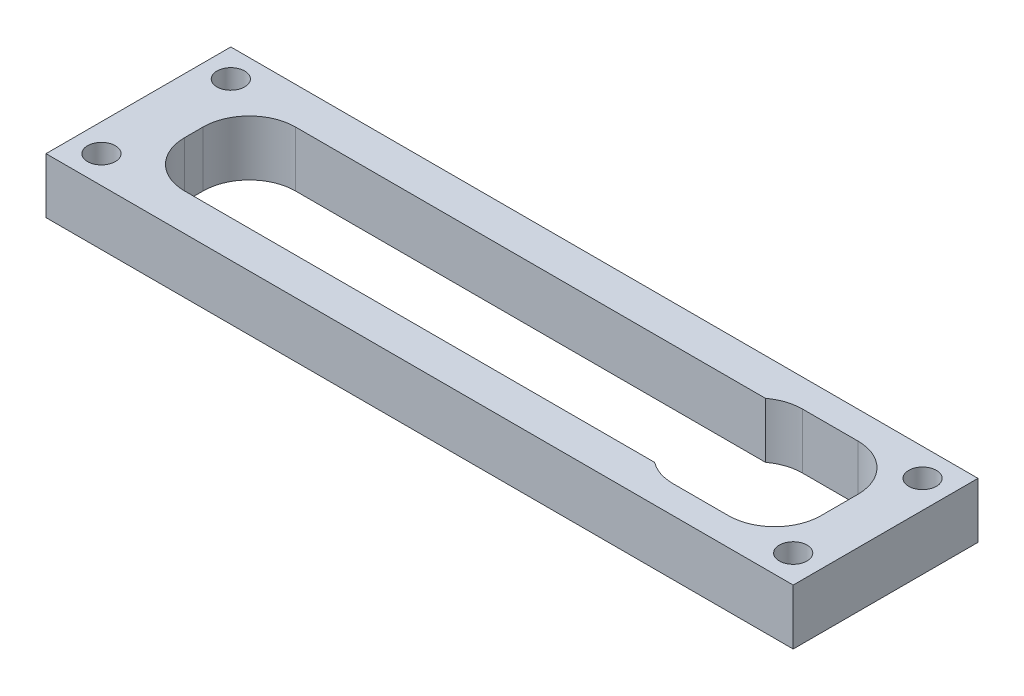
ISO-10303-21;
HEADER;
FILE_DESCRIPTION(('STEP AP214'),'2;1');
FILE_NAME('part.step','',(''),(''),'','','');
FILE_SCHEMA(('AUTOMOTIVE_DESIGN { 1 0 10303 214 1 1 1 1 }'));
ENDSEC;
DATA;
#1=APPLICATION_CONTEXT('core data for automotive mechanical design processes');
#2=APPLICATION_PROTOCOL_DEFINITION('international standard','automotive_design',2000,#1);
#3=PRODUCT_CONTEXT('',#1,'mechanical');
#4=PRODUCT('Part','Part','',(#3));
#5=PRODUCT_RELATED_PRODUCT_CATEGORY('part','',(#4));
#6=PRODUCT_DEFINITION_FORMATION('','',#4);
#7=PRODUCT_DEFINITION_CONTEXT('part definition',#1,'design');
#8=PRODUCT_DEFINITION('design','',#6,#7);
#9=PRODUCT_DEFINITION_SHAPE('','',#8);
#10=(LENGTH_UNIT() NAMED_UNIT(*) SI_UNIT(.MILLI.,.METRE.));
#11=(NAMED_UNIT(*) PLANE_ANGLE_UNIT() SI_UNIT($,.RADIAN.));
#12=(NAMED_UNIT(*) SI_UNIT($,.STERADIAN.) SOLID_ANGLE_UNIT());
#13=UNCERTAINTY_MEASURE_WITH_UNIT(LENGTH_MEASURE(1.E-05),#10,'distance_accuracy_value','');
#14=(GEOMETRIC_REPRESENTATION_CONTEXT(3) GLOBAL_UNCERTAINTY_ASSIGNED_CONTEXT((#13)) GLOBAL_UNIT_ASSIGNED_CONTEXT((#10,
#11,#12)) REPRESENTATION_CONTEXT('',''));
#15=CARTESIAN_POINT('',(0.,0.,0.));
#16=DIRECTION('',(0.,0.,1.));
#17=DIRECTION('',(1.,0.,0.));
#18=AXIS2_PLACEMENT_3D('',#15,#16,#17);
#19=CARTESIAN_POINT('',(0.,6.,0.));
#20=DIRECTION('',(0.,-1.,0.));
#21=DIRECTION('',(0.,0.,-1.));
#22=AXIS2_PLACEMENT_3D('',#19,#20,#21);
#23=PLANE('',#22);
#24=DIRECTION('',(0.,0.,1.));
#25=VECTOR('',#24,1.);
#26=CARTESIAN_POINT('',(0.,6.,0.));
#27=LINE('',#26,#25);
#28=CARTESIAN_POINT('',(0.,6.,-20.));
#29=VERTEX_POINT('',#28);
#30=CARTESIAN_POINT('',(0.,6.,0.));
#31=VERTEX_POINT('',#30);
#32=EDGE_CURVE('E250',#29,#31,#27,.T.);
#33=ORIENTED_EDGE('',*,*,#32,.T.);
#34=DIRECTION('',(1.,0.,0.));
#35=VECTOR('',#34,1.);
#36=CARTESIAN_POINT('',(0.,6.,0.));
#37=LINE('',#36,#35);
#38=CARTESIAN_POINT('',(80.8638902656017,6.,0.));
#39=VERTEX_POINT('',#38);
#40=EDGE_CURVE('E253',#31,#39,#37,.T.);
#41=ORIENTED_EDGE('',*,*,#40,.T.);
#42=DIRECTION('',(0.,0.,-1.));
#43=VECTOR('',#42,1.);
#44=CARTESIAN_POINT('',(80.8638902656017,6.,0.));
#45=LINE('',#44,#43);
#46=CARTESIAN_POINT('',(80.8638902656017,6.,-20.));
#47=VERTEX_POINT('',#46);
#48=EDGE_CURVE('E256',#39,#47,#45,.T.);
#49=ORIENTED_EDGE('',*,*,#48,.T.);
#50=DIRECTION('',(-1.,0.,0.));
#51=VECTOR('',#50,1.);
#52=CARTESIAN_POINT('',(0.,6.,-20.));
#53=LINE('',#52,#51);
#54=EDGE_CURVE('E258',#47,#29,#53,.T.);
#55=ORIENTED_EDGE('',*,*,#54,.T.);
#56=EDGE_LOOP('',(#33,#41,#49,#55));
#57=FACE_BOUND('',#56,.T.);
#58=DIRECTION('',(-1.,0.,0.));
#59=VECTOR('',#58,1.);
#60=CARTESIAN_POINT('',(5.99999999999999,6.,-16.));
#61=LINE('',#60,#59);
#62=CARTESIAN_POINT('',(61.8638902656017,6.,-16.));
#63=VERTEX_POINT('',#62);
#64=CARTESIAN_POINT('',(11.,6.,-16.));
#65=VERTEX_POINT('',#64);
#66=EDGE_CURVE('E243',#63,#65,#61,.T.);
#67=ORIENTED_EDGE('',*,*,#66,.F.);
#68=CARTESIAN_POINT('',(64.8638902656017,6.,-12.));
#69=DIRECTION('',(0.,-1.,0.));
#70=DIRECTION('',(0.,0.,-1.));
#71=AXIS2_PLACEMENT_3D('',#68,#69,#70);
#72=CIRCLE('',#71,5.);
#73=CARTESIAN_POINT('',(64.8638902656017,6.,-17.));
#74=VERTEX_POINT('',#73);
#75=EDGE_CURVE('E193',#63,#74,#72,.T.);
#76=ORIENTED_EDGE('',*,*,#75,.T.);
#77=DIRECTION('',(-1.,0.,0.));
#78=VECTOR('',#77,1.);
#79=CARTESIAN_POINT('',(61.8638902656017,6.,-17.));
#80=LINE('',#79,#78);
#81=CARTESIAN_POINT('',(70.8638902656017,6.,-17.));
#82=VERTEX_POINT('',#81);
#83=EDGE_CURVE('E205',#82,#74,#80,.T.);
#84=ORIENTED_EDGE('',*,*,#83,.F.);
#85=CARTESIAN_POINT('',(70.8638902656017,6.,-12.));
#86=DIRECTION('',(0.,-1.,0.));
#87=DIRECTION('',(0.,0.,-1.));
#88=AXIS2_PLACEMENT_3D('',#85,#86,#87);
#89=CIRCLE('',#88,5.);
#90=CARTESIAN_POINT('',(75.8638902656017,6.,-12.));
#91=VERTEX_POINT('',#90);
#92=EDGE_CURVE('E185',#82,#91,#89,.T.);
#93=ORIENTED_EDGE('',*,*,#92,.T.);
#94=DIRECTION('',(0.,0.,-1.));
#95=VECTOR('',#94,1.);
#96=CARTESIAN_POINT('',(75.8638902656017,6.,-17.));
#97=LINE('',#96,#95);
#98=CARTESIAN_POINT('',(75.8638902656017,6.,-8.00000000000001));
#99=VERTEX_POINT('',#98);
#100=EDGE_CURVE('E202',#99,#91,#97,.T.);
#101=ORIENTED_EDGE('',*,*,#100,.F.);
#102=CARTESIAN_POINT('',(70.8638902656017,6.,-8.00000000000001));
#103=DIRECTION('',(0.,-1.,0.));
#104=DIRECTION('',(0.,0.,-1.));
#105=AXIS2_PLACEMENT_3D('',#102,#103,#104);
#106=CIRCLE('',#105,5.);
#107=CARTESIAN_POINT('',(70.8638902656017,6.,-3.00000000000001));
#108=VERTEX_POINT('',#107);
#109=EDGE_CURVE('E189',#99,#108,#106,.T.);
#110=ORIENTED_EDGE('',*,*,#109,.T.);
#111=DIRECTION('',(1.,0.,0.));
#112=VECTOR('',#111,1.);
#113=CARTESIAN_POINT('',(61.8638902656017,6.,-3.00000000000001));
#114=LINE('',#113,#112);
#115=CARTESIAN_POINT('',(64.8638902656017,6.,-3.00000000000001));
#116=VERTEX_POINT('',#115);
#117=EDGE_CURVE('E200',#116,#108,#114,.T.);
#118=ORIENTED_EDGE('',*,*,#117,.F.);
#119=CARTESIAN_POINT('',(64.8638902656017,6.,-8.00000000000001));
#120=DIRECTION('',(0.,-1.,0.));
#121=DIRECTION('',(0.,0.,-1.));
#122=AXIS2_PLACEMENT_3D('',#119,#120,#121);
#123=CIRCLE('',#122,5.);
#124=CARTESIAN_POINT('',(61.8638902656017,6.,-4.00000000000001));
#125=VERTEX_POINT('',#124);
#126=EDGE_CURVE('E43',#116,#125,#123,.T.);
#127=ORIENTED_EDGE('',*,*,#126,.T.);
#128=DIRECTION('',(1.,0.,0.));
#129=VECTOR('',#128,1.);
#130=CARTESIAN_POINT('',(5.99999999999999,6.,-4.00000000000002));
#131=LINE('',#130,#129);
#132=CARTESIAN_POINT('',(11.,6.,-4.00000000000002));
#133=VERTEX_POINT('',#132);
#134=EDGE_CURVE('E162',#133,#125,#131,.T.);
#135=ORIENTED_EDGE('',*,*,#134,.F.);
#136=CARTESIAN_POINT('',(11.,6.,-9.00000000000001));
#137=DIRECTION('',(0.,-1.,0.));
#138=DIRECTION('',(0.,0.,-1.));
#139=AXIS2_PLACEMENT_3D('',#136,#137,#138);
#140=CIRCLE('',#139,5.);
#141=CARTESIAN_POINT('',(5.99999999999999,6.,-9.00000000000001));
#142=VERTEX_POINT('',#141);
#143=EDGE_CURVE('E179',#133,#142,#140,.T.);
#144=ORIENTED_EDGE('',*,*,#143,.T.);
#145=DIRECTION('',(0.,0.,1.));
#146=VECTOR('',#145,1.);
#147=CARTESIAN_POINT('',(5.99999999999999,6.,-16.));
#148=LINE('',#147,#146);
#149=CARTESIAN_POINT('',(5.99999999999999,6.,-11.));
#150=VERTEX_POINT('',#149);
#151=EDGE_CURVE('E239',#150,#142,#148,.T.);
#152=ORIENTED_EDGE('',*,*,#151,.F.);
#153=CARTESIAN_POINT('',(11.,6.,-11.));
#154=DIRECTION('',(0.,-1.,0.));
#155=DIRECTION('',(0.,0.,-1.));
#156=AXIS2_PLACEMENT_3D('',#153,#154,#155);
#157=CIRCLE('',#156,5.);
#158=EDGE_CURVE('E183',#150,#65,#157,.T.);
#159=ORIENTED_EDGE('',*,*,#158,.T.);
#160=EDGE_LOOP('',(#67,#76,#84,#93,#101,#110,#118,#127,#135,#144,#152,#159));
#161=FACE_BOUND('',#160,.T.);
#162=CARTESIAN_POINT('',(3.,6.,-17.));
#163=DIRECTION('',(0.,1.,0.));
#164=DIRECTION('',(0.,0.,1.));
#165=AXIS2_PLACEMENT_3D('',#162,#163,#164);
#166=CIRCLE('',#165,1.5);
#167=CARTESIAN_POINT('',(3.,6.,-15.5));
#168=VERTEX_POINT('',#167);
#169=EDGE_CURVE('E234',#168,#168,#166,.T.);
#170=ORIENTED_EDGE('',*,*,#169,.F.);
#171=EDGE_LOOP('',(#170));
#172=FACE_BOUND('',#171,.T.);
#173=CARTESIAN_POINT('',(3.,6.,-3.));
#174=DIRECTION('',(0.,1.,0.));
#175=DIRECTION('',(0.,0.,-1.));
#176=AXIS2_PLACEMENT_3D('',#173,#174,#175);
#177=CIRCLE('',#176,1.5);
#178=CARTESIAN_POINT('',(3.,6.,-4.5));
#179=VERTEX_POINT('',#178);
#180=EDGE_CURVE('E228',#179,#179,#177,.T.);
#181=ORIENTED_EDGE('',*,*,#180,.F.);
#182=EDGE_LOOP('',(#181));
#183=FACE_BOUND('',#182,.T.);
#184=CARTESIAN_POINT('',(77.8638902656017,6.,-3.00000000000001));
#185=DIRECTION('',(0.,1.,0.));
#186=DIRECTION('',(0.,0.,1.));
#187=AXIS2_PLACEMENT_3D('',#184,#185,#186);
#188=CIRCLE('',#187,1.5);
#189=CARTESIAN_POINT('',(77.8638902656017,6.,-1.50000000000001));
#190=VERTEX_POINT('',#189);
#191=EDGE_CURVE('E222',#190,#190,#188,.T.);
#192=ORIENTED_EDGE('',*,*,#191,.F.);
#193=EDGE_LOOP('',(#192));
#194=FACE_BOUND('',#193,.T.);
#195=CARTESIAN_POINT('',(77.8638902656017,6.,-17.));
#196=DIRECTION('',(0.,1.,0.));
#197=DIRECTION('',(0.,0.,-1.));
#198=AXIS2_PLACEMENT_3D('',#195,#196,#197);
#199=CIRCLE('',#198,1.5);
#200=CARTESIAN_POINT('',(77.8638902656017,6.,-18.5));
#201=VERTEX_POINT('',#200);
#202=EDGE_CURVE('E216',#201,#201,#199,.T.);
#203=ORIENTED_EDGE('',*,*,#202,.F.);
#204=EDGE_LOOP('',(#203));
#205=FACE_BOUND('',#204,.T.);
#206=ADVANCED_FACE('F35',(#57,#161,#172,#183,#194,#205),#23,.F.);
#207=CARTESIAN_POINT('',(0.,0.,0.));
#208=DIRECTION('',(0.,-1.,0.));
#209=DIRECTION('',(0.,0.,-1.));
#210=AXIS2_PLACEMENT_3D('',#207,#208,#209);
#211=PLANE('',#210);
#212=DIRECTION('',(-1.,0.,0.));
#213=VECTOR('',#212,1.);
#214=CARTESIAN_POINT('',(61.8638902656017,0.,-17.));
#215=LINE('',#214,#213);
#216=CARTESIAN_POINT('',(70.8638902656017,0.,-17.));
#217=VERTEX_POINT('',#216);
#218=CARTESIAN_POINT('',(64.8638902656017,0.,-17.));
#219=VERTEX_POINT('',#218);
#220=EDGE_CURVE('E165',#217,#219,#215,.T.);
#221=ORIENTED_EDGE('',*,*,#220,.T.);
#222=CARTESIAN_POINT('',(64.8638902656017,0.,-12.));
#223=DIRECTION('',(0.,-1.,0.));
#224=DIRECTION('',(0.,0.,-1.));
#225=AXIS2_PLACEMENT_3D('',#222,#223,#224);
#226=CIRCLE('',#225,5.);
#227=CARTESIAN_POINT('',(61.8638902656017,0.,-16.));
#228=VERTEX_POINT('',#227);
#229=EDGE_CURVE('E195',#219,#228,#226,.F.);
#230=ORIENTED_EDGE('',*,*,#229,.T.);
#231=DIRECTION('',(-1.,0.,0.));
#232=VECTOR('',#231,1.);
#233=CARTESIAN_POINT('',(5.99999999999999,0.,-16.));
#234=LINE('',#233,#232);
#235=CARTESIAN_POINT('',(11.,0.,-16.));
#236=VERTEX_POINT('',#235);
#237=EDGE_CURVE('E154',#228,#236,#234,.T.);
#238=ORIENTED_EDGE('',*,*,#237,.T.);
#239=CARTESIAN_POINT('',(11.,0.,-11.));
#240=DIRECTION('',(0.,-1.,0.));
#241=DIRECTION('',(0.,0.,-1.));
#242=AXIS2_PLACEMENT_3D('',#239,#240,#241);
#243=CIRCLE('',#242,5.);
#244=CARTESIAN_POINT('',(5.99999999999999,0.,-11.));
#245=VERTEX_POINT('',#244);
#246=EDGE_CURVE('E181',#236,#245,#243,.F.);
#247=ORIENTED_EDGE('',*,*,#246,.T.);
#248=DIRECTION('',(0.,0.,1.));
#249=VECTOR('',#248,1.);
#250=CARTESIAN_POINT('',(5.99999999999999,0.,-16.));
#251=LINE('',#250,#249);
#252=CARTESIAN_POINT('',(5.99999999999999,0.,-9.00000000000001));
#253=VERTEX_POINT('',#252);
#254=EDGE_CURVE('E155',#245,#253,#251,.T.);
#255=ORIENTED_EDGE('',*,*,#254,.T.);
#256=CARTESIAN_POINT('',(11.,0.,-9.00000000000001));
#257=DIRECTION('',(0.,-1.,0.));
#258=DIRECTION('',(0.,0.,-1.));
#259=AXIS2_PLACEMENT_3D('',#256,#257,#258);
#260=CIRCLE('',#259,5.);
#261=CARTESIAN_POINT('',(11.,0.,-4.00000000000002));
#262=VERTEX_POINT('',#261);
#263=EDGE_CURVE('E151',#253,#262,#260,.F.);
#264=ORIENTED_EDGE('',*,*,#263,.T.);
#265=DIRECTION('',(1.,0.,0.));
#266=VECTOR('',#265,1.);
#267=CARTESIAN_POINT('',(5.99999999999999,0.,-4.00000000000002));
#268=LINE('',#267,#266);
#269=CARTESIAN_POINT('',(61.8638902656017,0.,-4.00000000000001));
#270=VERTEX_POINT('',#269);
#271=EDGE_CURVE('E145',#262,#270,#268,.T.);
#272=ORIENTED_EDGE('',*,*,#271,.T.);
#273=CARTESIAN_POINT('',(64.8638902656017,0.,-8.00000000000001));
#274=DIRECTION('',(0.,-1.,0.));
#275=DIRECTION('',(0.,0.,-1.));
#276=AXIS2_PLACEMENT_3D('',#273,#274,#275);
#277=CIRCLE('',#276,5.);
#278=CARTESIAN_POINT('',(64.8638902656017,0.,-3.00000000000001));
#279=VERTEX_POINT('',#278);
#280=EDGE_CURVE('E11',#270,#279,#277,.F.);
#281=ORIENTED_EDGE('',*,*,#280,.T.);
#282=DIRECTION('',(1.,0.,0.));
#283=VECTOR('',#282,1.);
#284=CARTESIAN_POINT('',(61.8638902656017,0.,-3.00000000000001));
#285=LINE('',#284,#283);
#286=CARTESIAN_POINT('',(70.8638902656017,0.,-3.00000000000001));
#287=VERTEX_POINT('',#286);
#288=EDGE_CURVE('E212',#279,#287,#285,.T.);
#289=ORIENTED_EDGE('',*,*,#288,.T.);
#290=CARTESIAN_POINT('',(70.8638902656017,0.,-8.00000000000001));
#291=DIRECTION('',(0.,-1.,0.));
#292=DIRECTION('',(0.,0.,-1.));
#293=AXIS2_PLACEMENT_3D('',#290,#291,#292);
#294=CIRCLE('',#293,5.);
#295=CARTESIAN_POINT('',(75.8638902656017,0.,-8.00000000000001));
#296=VERTEX_POINT('',#295);
#297=EDGE_CURVE('E191',#287,#296,#294,.F.);
#298=ORIENTED_EDGE('',*,*,#297,.T.);
#299=DIRECTION('',(0.,0.,-1.));
#300=VECTOR('',#299,1.);
#301=CARTESIAN_POINT('',(75.8638902656017,0.,-17.));
#302=LINE('',#301,#300);
#303=CARTESIAN_POINT('',(75.8638902656017,0.,-12.));
#304=VERTEX_POINT('',#303);
#305=EDGE_CURVE('E300',#296,#304,#302,.T.);
#306=ORIENTED_EDGE('',*,*,#305,.T.);
#307=CARTESIAN_POINT('',(70.8638902656017,0.,-12.));
#308=DIRECTION('',(0.,-1.,0.));
#309=DIRECTION('',(0.,0.,-1.));
#310=AXIS2_PLACEMENT_3D('',#307,#308,#309);
#311=CIRCLE('',#310,5.);
#312=EDGE_CURVE('E187',#304,#217,#311,.F.);
#313=ORIENTED_EDGE('',*,*,#312,.T.);
#314=EDGE_LOOP('',(#221,#230,#238,#247,#255,#264,#272,#281,#289,#298,#306,#313));
#315=FACE_BOUND('',#314,.T.);
#316=CARTESIAN_POINT('',(77.8638902656017,0.,-3.00000000000001));
#317=DIRECTION('',(0.,1.,0.));
#318=DIRECTION('',(0.,0.,1.));
#319=AXIS2_PLACEMENT_3D('',#316,#317,#318);
#320=CIRCLE('',#319,1.5);
#321=CARTESIAN_POINT('',(77.8638902656017,0.,-1.50000000000001));
#322=VERTEX_POINT('',#321);
#323=EDGE_CURVE('E219',#322,#322,#320,.T.);
#324=ORIENTED_EDGE('',*,*,#323,.T.);
#325=EDGE_LOOP('',(#324));
#326=FACE_BOUND('',#325,.T.);
#327=CARTESIAN_POINT('',(3.,0.,-17.));
#328=DIRECTION('',(0.,1.,0.));
#329=DIRECTION('',(0.,0.,1.));
#330=AXIS2_PLACEMENT_3D('',#327,#328,#329);
#331=CIRCLE('',#330,1.5);
#332=CARTESIAN_POINT('',(3.,0.,-15.5));
#333=VERTEX_POINT('',#332);
#334=EDGE_CURVE('E231',#333,#333,#331,.T.);
#335=ORIENTED_EDGE('',*,*,#334,.T.);
#336=EDGE_LOOP('',(#335));
#337=FACE_BOUND('',#336,.T.);
#338=DIRECTION('',(0.,0.,1.));
#339=VECTOR('',#338,1.);
#340=CARTESIAN_POINT('',(0.,0.,0.));
#341=LINE('',#340,#339);
#342=CARTESIAN_POINT('',(0.,0.,-20.));
#343=VERTEX_POINT('',#342);
#344=CARTESIAN_POINT('',(0.,0.,0.));
#345=VERTEX_POINT('',#344);
#346=EDGE_CURVE('E246',#343,#345,#341,.T.);
#347=ORIENTED_EDGE('',*,*,#346,.F.);
#348=DIRECTION('',(-1.,0.,0.));
#349=VECTOR('',#348,1.);
#350=CARTESIAN_POINT('',(0.,0.,-20.));
#351=LINE('',#350,#349);
#352=CARTESIAN_POINT('',(80.8638902656017,0.,-20.));
#353=VERTEX_POINT('',#352);
#354=EDGE_CURVE('E254',#353,#343,#351,.T.);
#355=ORIENTED_EDGE('',*,*,#354,.F.);
#356=DIRECTION('',(0.,0.,-1.));
#357=VECTOR('',#356,1.);
#358=CARTESIAN_POINT('',(80.8638902656017,0.,0.));
#359=LINE('',#358,#357);
#360=CARTESIAN_POINT('',(80.8638902656017,0.,0.));
#361=VERTEX_POINT('',#360);
#362=EDGE_CURVE('E265',#361,#353,#359,.T.);
#363=ORIENTED_EDGE('',*,*,#362,.F.);
#364=DIRECTION('',(1.,0.,0.));
#365=VECTOR('',#364,1.);
#366=CARTESIAN_POINT('',(0.,0.,0.));
#367=LINE('',#366,#365);
#368=EDGE_CURVE('E263',#345,#361,#367,.T.);
#369=ORIENTED_EDGE('',*,*,#368,.F.);
#370=EDGE_LOOP('',(#347,#355,#363,#369));
#371=FACE_BOUND('',#370,.T.);
#372=CARTESIAN_POINT('',(3.,0.,-3.));
#373=DIRECTION('',(0.,1.,0.));
#374=DIRECTION('',(0.,0.,-1.));
#375=AXIS2_PLACEMENT_3D('',#372,#373,#374);
#376=CIRCLE('',#375,1.5);
#377=CARTESIAN_POINT('',(3.,0.,-4.5));
#378=VERTEX_POINT('',#377);
#379=EDGE_CURVE('E225',#378,#378,#376,.T.);
#380=ORIENTED_EDGE('',*,*,#379,.T.);
#381=EDGE_LOOP('',(#380));
#382=FACE_BOUND('',#381,.T.);
#383=CARTESIAN_POINT('',(77.8638902656017,0.,-17.));
#384=DIRECTION('',(0.,1.,0.));
#385=DIRECTION('',(0.,0.,-1.));
#386=AXIS2_PLACEMENT_3D('',#383,#384,#385);
#387=CIRCLE('',#386,1.5);
#388=CARTESIAN_POINT('',(77.8638902656017,0.,-18.5));
#389=VERTEX_POINT('',#388);
#390=EDGE_CURVE('E214',#389,#389,#387,.T.);
#391=ORIENTED_EDGE('',*,*,#390,.T.);
#392=EDGE_LOOP('',(#391));
#393=FACE_BOUND('',#392,.T.);
#394=ADVANCED_FACE('F148',(#315,#326,#337,#371,#382,#393),#211,.T.);
#395=CARTESIAN_POINT('',(0.,6.,0.));
#396=DIRECTION('',(1.,0.,0.));
#397=DIRECTION('',(0.,0.,-1.));
#398=AXIS2_PLACEMENT_3D('',#395,#396,#397);
#399=PLANE('',#398);
#400=ORIENTED_EDGE('',*,*,#346,.T.);
#401=DIRECTION('',(0.,-1.,0.));
#402=VECTOR('',#401,1.);
#403=CARTESIAN_POINT('',(0.,6.,0.));
#404=LINE('',#403,#402);
#405=EDGE_CURVE('E276',#31,#345,#404,.T.);
#406=ORIENTED_EDGE('',*,*,#405,.F.);
#407=ORIENTED_EDGE('',*,*,#32,.F.);
#408=DIRECTION('',(0.,-1.,0.));
#409=VECTOR('',#408,1.);
#410=CARTESIAN_POINT('',(0.,6.,-20.));
#411=LINE('',#410,#409);
#412=EDGE_CURVE('E260',#29,#343,#411,.T.);
#413=ORIENTED_EDGE('',*,*,#412,.T.);
#414=EDGE_LOOP('',(#400,#406,#407,#413));
#415=FACE_BOUND('',#414,.T.);
#416=ADVANCED_FACE('F331',(#415),#399,.F.);
#417=CARTESIAN_POINT('',(0.,6.,0.));
#418=DIRECTION('',(0.,0.,-1.));
#419=DIRECTION('',(-1.,0.,0.));
#420=AXIS2_PLACEMENT_3D('',#417,#418,#419);
#421=PLANE('',#420);
#422=ORIENTED_EDGE('',*,*,#368,.T.);
#423=DIRECTION('',(0.,-1.,0.));
#424=VECTOR('',#423,1.);
#425=CARTESIAN_POINT('',(80.8638902656017,6.,0.));
#426=LINE('',#425,#424);
#427=EDGE_CURVE('E273',#39,#361,#426,.T.);
#428=ORIENTED_EDGE('',*,*,#427,.F.);
#429=ORIENTED_EDGE('',*,*,#40,.F.);
#430=ORIENTED_EDGE('',*,*,#405,.T.);
#431=EDGE_LOOP('',(#422,#428,#429,#430));
#432=FACE_BOUND('',#431,.T.);
#433=ADVANCED_FACE('F344',(#432),#421,.F.);
#434=CARTESIAN_POINT('',(80.8638902656017,6.,0.));
#435=DIRECTION('',(-1.,0.,0.));
#436=DIRECTION('',(0.,0.,1.));
#437=AXIS2_PLACEMENT_3D('',#434,#435,#436);
#438=PLANE('',#437);
#439=ORIENTED_EDGE('',*,*,#362,.T.);
#440=DIRECTION('',(0.,-1.,0.));
#441=VECTOR('',#440,1.);
#442=CARTESIAN_POINT('',(80.8638902656017,6.,-20.));
#443=LINE('',#442,#441);
#444=EDGE_CURVE('E270',#47,#353,#443,.T.);
#445=ORIENTED_EDGE('',*,*,#444,.F.);
#446=ORIENTED_EDGE('',*,*,#48,.F.);
#447=ORIENTED_EDGE('',*,*,#427,.T.);
#448=EDGE_LOOP('',(#439,#445,#446,#447));
#449=FACE_BOUND('',#448,.T.);
#450=ADVANCED_FACE('F340',(#449),#438,.F.);
#451=CARTESIAN_POINT('',(0.,6.,-20.));
#452=DIRECTION('',(0.,0.,1.));
#453=DIRECTION('',(1.,0.,0.));
#454=AXIS2_PLACEMENT_3D('',#451,#452,#453);
#455=PLANE('',#454);
#456=ORIENTED_EDGE('',*,*,#354,.T.);
#457=ORIENTED_EDGE('',*,*,#412,.F.);
#458=ORIENTED_EDGE('',*,*,#54,.F.);
#459=ORIENTED_EDGE('',*,*,#444,.T.);
#460=EDGE_LOOP('',(#456,#457,#458,#459));
#461=FACE_BOUND('',#460,.T.);
#462=ADVANCED_FACE('F337',(#461),#455,.F.);
#463=CARTESIAN_POINT('',(5.99999999999999,6.,-16.));
#464=DIRECTION('',(1.,0.,0.));
#465=DIRECTION('',(0.,0.,-1.));
#466=AXIS2_PLACEMENT_3D('',#463,#464,#465);
#467=PLANE('',#466);
#468=ORIENTED_EDGE('',*,*,#151,.T.);
#469=DIRECTION('',(0.,-1.,0.));
#470=VECTOR('',#469,1.);
#471=CARTESIAN_POINT('',(5.99999999999999,0.,-9.00000000000001));
#472=LINE('',#471,#470);
#473=EDGE_CURVE('E281',#142,#253,#472,.T.);
#474=ORIENTED_EDGE('',*,*,#473,.T.);
#475=ORIENTED_EDGE('',*,*,#254,.F.);
#476=DIRECTION('',(0.,-1.,0.));
#477=VECTOR('',#476,1.);
#478=CARTESIAN_POINT('',(5.99999999999999,6.,-11.));
#479=LINE('',#478,#477);
#480=EDGE_CURVE('E279',#245,#150,#479,.F.);
#481=ORIENTED_EDGE('',*,*,#480,.T.);
#482=EDGE_LOOP('',(#468,#474,#475,#481));
#483=FACE_BOUND('',#482,.T.);
#484=ADVANCED_FACE('F334',(#483),#467,.T.);
#485=CARTESIAN_POINT('',(5.99999999999999,6.,-4.00000000000002));
#486=DIRECTION('',(0.,0.,-1.));
#487=DIRECTION('',(-1.,0.,0.));
#488=AXIS2_PLACEMENT_3D('',#485,#486,#487);
#489=PLANE('',#488);
#490=ORIENTED_EDGE('',*,*,#271,.F.);
#491=DIRECTION('',(0.,-1.,0.));
#492=VECTOR('',#491,1.);
#493=CARTESIAN_POINT('',(11.,6.,-4.00000000000002));
#494=LINE('',#493,#492);
#495=EDGE_CURVE('E284',#262,#133,#494,.F.);
#496=ORIENTED_EDGE('',*,*,#495,.T.);
#497=ORIENTED_EDGE('',*,*,#134,.T.);
#498=DIRECTION('',(0.,1.,0.));
#499=VECTOR('',#498,1.);
#500=CARTESIAN_POINT('',(61.8638902656017,0.,-4.00000000000001));
#501=LINE('',#500,#499);
#502=EDGE_CURVE('E159',#270,#125,#501,.T.);
#503=ORIENTED_EDGE('',*,*,#502,.F.);
#504=EDGE_LOOP('',(#490,#496,#497,#503));
#505=FACE_BOUND('',#504,.T.);
#506=ADVANCED_FACE('F160',(#505),#489,.T.);
#507=CARTESIAN_POINT('',(5.99999999999999,6.,-16.));
#508=DIRECTION('',(0.,0.,1.));
#509=DIRECTION('',(1.,0.,0.));
#510=AXIS2_PLACEMENT_3D('',#507,#508,#509);
#511=PLANE('',#510);
#512=ORIENTED_EDGE('',*,*,#66,.T.);
#513=DIRECTION('',(0.,-1.,0.));
#514=VECTOR('',#513,1.);
#515=CARTESIAN_POINT('',(11.,0.,-16.));
#516=LINE('',#515,#514);
#517=EDGE_CURVE('E286',#65,#236,#516,.T.);
#518=ORIENTED_EDGE('',*,*,#517,.T.);
#519=ORIENTED_EDGE('',*,*,#237,.F.);
#520=DIRECTION('',(0.,1.,0.));
#521=VECTOR('',#520,1.);
#522=CARTESIAN_POINT('',(61.8638902656017,0.,-16.));
#523=LINE('',#522,#521);
#524=EDGE_CURVE('E164',#228,#63,#523,.T.);
#525=ORIENTED_EDGE('',*,*,#524,.T.);
#526=EDGE_LOOP('',(#512,#518,#519,#525));
#527=FACE_BOUND('',#526,.T.);
#528=ADVANCED_FACE('F366',(#527),#511,.T.);
#529=CARTESIAN_POINT('',(3.,6.,-17.));
#530=DIRECTION('',(0.,-1.,0.));
#531=DIRECTION('',(0.,0.,-1.));
#532=AXIS2_PLACEMENT_3D('',#529,#530,#531);
#533=CYLINDRICAL_SURFACE('',#532,1.5);
#534=ORIENTED_EDGE('',*,*,#169,.T.);
#535=EDGE_LOOP('',(#534));
#536=FACE_BOUND('',#535,.T.);
#537=ORIENTED_EDGE('',*,*,#334,.F.);
#538=EDGE_LOOP('',(#537));
#539=FACE_BOUND('',#538,.T.);
#540=ADVANCED_FACE('F379',(#536,#539),#533,.F.);
#541=CARTESIAN_POINT('',(3.,6.,-3.));
#542=DIRECTION('',(0.,-1.,0.));
#543=DIRECTION('',(0.,0.,-1.));
#544=AXIS2_PLACEMENT_3D('',#541,#542,#543);
#545=CYLINDRICAL_SURFACE('',#544,1.5);
#546=ORIENTED_EDGE('',*,*,#180,.T.);
#547=EDGE_LOOP('',(#546));
#548=FACE_BOUND('',#547,.T.);
#549=ORIENTED_EDGE('',*,*,#379,.F.);
#550=EDGE_LOOP('',(#549));
#551=FACE_BOUND('',#550,.T.);
#552=ADVANCED_FACE('F384',(#548,#551),#545,.F.);
#553=CARTESIAN_POINT('',(77.8638902656017,6.,-3.00000000000001));
#554=DIRECTION('',(0.,-1.,0.));
#555=DIRECTION('',(0.,0.,-1.));
#556=AXIS2_PLACEMENT_3D('',#553,#554,#555);
#557=CYLINDRICAL_SURFACE('',#556,1.5);
#558=ORIENTED_EDGE('',*,*,#191,.T.);
#559=EDGE_LOOP('',(#558));
#560=FACE_BOUND('',#559,.T.);
#561=ORIENTED_EDGE('',*,*,#323,.F.);
#562=EDGE_LOOP('',(#561));
#563=FACE_BOUND('',#562,.T.);
#564=ADVANCED_FACE('F388',(#560,#563),#557,.F.);
#565=CARTESIAN_POINT('',(77.8638902656017,6.,-17.));
#566=DIRECTION('',(0.,-1.,0.));
#567=DIRECTION('',(0.,0.,-1.));
#568=AXIS2_PLACEMENT_3D('',#565,#566,#567);
#569=CYLINDRICAL_SURFACE('',#568,1.5);
#570=ORIENTED_EDGE('',*,*,#202,.T.);
#571=EDGE_LOOP('',(#570));
#572=FACE_BOUND('',#571,.T.);
#573=ORIENTED_EDGE('',*,*,#390,.F.);
#574=EDGE_LOOP('',(#573));
#575=FACE_BOUND('',#574,.T.);
#576=ADVANCED_FACE('F392',(#572,#575),#569,.F.);
#577=CARTESIAN_POINT('',(61.8638902656017,0.,-17.));
#578=DIRECTION('',(0.,0.,-1.));
#579=DIRECTION('',(-1.,0.,0.));
#580=AXIS2_PLACEMENT_3D('',#577,#578,#579);
#581=PLANE('',#580);
#582=ORIENTED_EDGE('',*,*,#220,.F.);
#583=DIRECTION('',(0.,1.,0.));
#584=VECTOR('',#583,1.);
#585=CARTESIAN_POINT('',(70.8638902656017,6.,-17.));
#586=LINE('',#585,#584);
#587=EDGE_CURVE('E291',#217,#82,#586,.T.);
#588=ORIENTED_EDGE('',*,*,#587,.T.);
#589=ORIENTED_EDGE('',*,*,#83,.T.);
#590=DIRECTION('',(0.,1.,0.));
#591=VECTOR('',#590,1.);
#592=CARTESIAN_POINT('',(64.8638902656017,0.,-17.));
#593=LINE('',#592,#591);
#594=EDGE_CURVE('E289',#74,#219,#593,.F.);
#595=ORIENTED_EDGE('',*,*,#594,.T.);
#596=EDGE_LOOP('',(#582,#588,#589,#595));
#597=FACE_BOUND('',#596,.T.);
#598=ADVANCED_FACE('F310',(#597),#581,.F.);
#599=CARTESIAN_POINT('',(75.8638902656017,0.,-17.));
#600=DIRECTION('',(1.,0.,0.));
#601=DIRECTION('',(0.,0.,-1.));
#602=AXIS2_PLACEMENT_3D('',#599,#600,#601);
#603=PLANE('',#602);
#604=ORIENTED_EDGE('',*,*,#100,.T.);
#605=DIRECTION('',(0.,1.,0.));
#606=VECTOR('',#605,1.);
#607=CARTESIAN_POINT('',(75.8638902656017,0.,-12.));
#608=LINE('',#607,#606);
#609=EDGE_CURVE('E171',#91,#304,#608,.F.);
#610=ORIENTED_EDGE('',*,*,#609,.T.);
#611=ORIENTED_EDGE('',*,*,#305,.F.);
#612=DIRECTION('',(0.,1.,0.));
#613=VECTOR('',#612,1.);
#614=CARTESIAN_POINT('',(75.8638902656017,6.,-8.00000000000001));
#615=LINE('',#614,#613);
#616=EDGE_CURVE('E174',#296,#99,#615,.T.);
#617=ORIENTED_EDGE('',*,*,#616,.T.);
#618=EDGE_LOOP('',(#604,#610,#611,#617));
#619=FACE_BOUND('',#618,.T.);
#620=ADVANCED_FACE('F297',(#619),#603,.F.);
#621=CARTESIAN_POINT('',(61.8638902656017,0.,-3.00000000000001));
#622=DIRECTION('',(0.,0.,1.));
#623=DIRECTION('',(1.,0.,0.));
#624=AXIS2_PLACEMENT_3D('',#621,#622,#623);
#625=PLANE('',#624);
#626=ORIENTED_EDGE('',*,*,#117,.T.);
#627=DIRECTION('',(0.,1.,0.));
#628=VECTOR('',#627,1.);
#629=CARTESIAN_POINT('',(70.8638902656017,0.,-3.00000000000001));
#630=LINE('',#629,#628);
#631=EDGE_CURVE('E50',#108,#287,#630,.F.);
#632=ORIENTED_EDGE('',*,*,#631,.T.);
#633=ORIENTED_EDGE('',*,*,#288,.F.);
#634=DIRECTION('',(0.,-1.,0.));
#635=VECTOR('',#634,1.);
#636=CARTESIAN_POINT('',(64.8638902656017,0.,-3.00000000000001));
#637=LINE('',#636,#635);
#638=EDGE_CURVE('E169',#279,#116,#637,.F.);
#639=ORIENTED_EDGE('',*,*,#638,.T.);
#640=EDGE_LOOP('',(#626,#632,#633,#639));
#641=FACE_BOUND('',#640,.T.);
#642=ADVANCED_FACE('F355',(#641),#625,.F.);
#643=CARTESIAN_POINT('',(11.,6.,-9.00000000000001));
#644=DIRECTION('',(0.,1.,0.));
#645=DIRECTION('',(0.,0.,1.));
#646=AXIS2_PLACEMENT_3D('',#643,#644,#645);
#647=CYLINDRICAL_SURFACE('',#646,5.);
#648=ORIENTED_EDGE('',*,*,#143,.F.);
#649=ORIENTED_EDGE('',*,*,#495,.F.);
#650=ORIENTED_EDGE('',*,*,#263,.F.);
#651=ORIENTED_EDGE('',*,*,#473,.F.);
#652=EDGE_LOOP('',(#648,#649,#650,#651));
#653=FACE_BOUND('',#652,.T.);
#654=ADVANCED_FACE('F352',(#653),#647,.F.);
#655=CARTESIAN_POINT('',(11.,6.,-11.));
#656=DIRECTION('',(0.,1.,0.));
#657=DIRECTION('',(0.,0.,1.));
#658=AXIS2_PLACEMENT_3D('',#655,#656,#657);
#659=CYLINDRICAL_SURFACE('',#658,5.);
#660=ORIENTED_EDGE('',*,*,#158,.F.);
#661=ORIENTED_EDGE('',*,*,#480,.F.);
#662=ORIENTED_EDGE('',*,*,#246,.F.);
#663=ORIENTED_EDGE('',*,*,#517,.F.);
#664=EDGE_LOOP('',(#660,#661,#662,#663));
#665=FACE_BOUND('',#664,.T.);
#666=ADVANCED_FACE('F323',(#665),#659,.F.);
#667=CARTESIAN_POINT('',(70.8638902656017,0.,-12.));
#668=DIRECTION('',(0.,-1.,0.));
#669=DIRECTION('',(0.,0.,-1.));
#670=AXIS2_PLACEMENT_3D('',#667,#668,#669);
#671=CYLINDRICAL_SURFACE('',#670,5.);
#672=ORIENTED_EDGE('',*,*,#312,.F.);
#673=ORIENTED_EDGE('',*,*,#609,.F.);
#674=ORIENTED_EDGE('',*,*,#92,.F.);
#675=ORIENTED_EDGE('',*,*,#587,.F.);
#676=EDGE_LOOP('',(#672,#673,#674,#675));
#677=FACE_BOUND('',#676,.T.);
#678=ADVANCED_FACE('F307',(#677),#671,.F.);
#679=CARTESIAN_POINT('',(70.8638902656017,0.,-8.00000000000001));
#680=DIRECTION('',(0.,-1.,0.));
#681=DIRECTION('',(0.,0.,-1.));
#682=AXIS2_PLACEMENT_3D('',#679,#680,#681);
#683=CYLINDRICAL_SURFACE('',#682,5.);
#684=ORIENTED_EDGE('',*,*,#297,.F.);
#685=ORIENTED_EDGE('',*,*,#631,.F.);
#686=ORIENTED_EDGE('',*,*,#109,.F.);
#687=ORIENTED_EDGE('',*,*,#616,.F.);
#688=EDGE_LOOP('',(#684,#685,#686,#687));
#689=FACE_BOUND('',#688,.T.);
#690=ADVANCED_FACE('F314',(#689),#683,.F.);
#691=CARTESIAN_POINT('',(64.8638902656017,0.,-12.));
#692=DIRECTION('',(0.,1.,0.));
#693=DIRECTION('',(0.,0.,1.));
#694=AXIS2_PLACEMENT_3D('',#691,#692,#693);
#695=CYLINDRICAL_SURFACE('',#694,5.);
#696=ORIENTED_EDGE('',*,*,#229,.F.);
#697=ORIENTED_EDGE('',*,*,#594,.F.);
#698=ORIENTED_EDGE('',*,*,#75,.F.);
#699=ORIENTED_EDGE('',*,*,#524,.F.);
#700=EDGE_LOOP('',(#696,#697,#698,#699));
#701=FACE_BOUND('',#700,.T.);
#702=ADVANCED_FACE('F316',(#701),#695,.F.);
#703=CARTESIAN_POINT('',(64.8638902656017,0.,-8.00000000000001));
#704=DIRECTION('',(0.,-1.,0.));
#705=DIRECTION('',(0.,0.,-1.));
#706=AXIS2_PLACEMENT_3D('',#703,#704,#705);
#707=CYLINDRICAL_SURFACE('',#706,5.);
#708=ORIENTED_EDGE('',*,*,#280,.F.);
#709=ORIENTED_EDGE('',*,*,#502,.T.);
#710=ORIENTED_EDGE('',*,*,#126,.F.);
#711=ORIENTED_EDGE('',*,*,#638,.F.);
#712=EDGE_LOOP('',(#708,#709,#710,#711));
#713=FACE_BOUND('',#712,.T.);
#714=ADVANCED_FACE('F37',(#713),#707,.F.);
#715=CLOSED_SHELL('',(#206,#394,#416,#433,#450,#462,#484,#506,#528,#540,#552,#564,#576,#598,
#620,#642,#654,#666,#678,#690,#702,#714));
#716=MANIFOLD_SOLID_BREP('B2',#715);
#717=ADVANCED_BREP_SHAPE_REPRESENTATION('',(#18,#716),#14);
#718=SHAPE_DEFINITION_REPRESENTATION(#9,#717);
ENDSEC;
END-ISO-10303-21;
